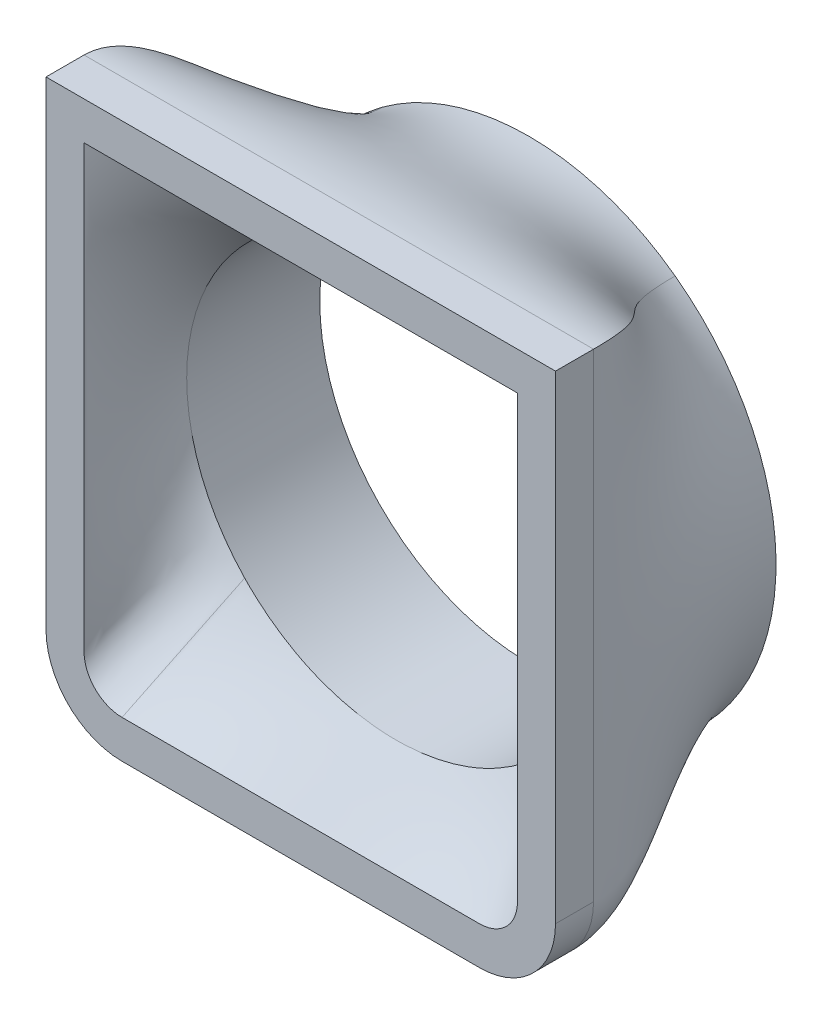
ISO-10303-21;
HEADER;
FILE_DESCRIPTION(('STEP AP214'),'2;1');
FILE_NAME('part.step','',(''),(''),'','','');
FILE_SCHEMA(('AUTOMOTIVE_DESIGN { 1 0 10303 214 1 1 1 1 }'));
ENDSEC;
DATA;
#1=APPLICATION_CONTEXT('core data for automotive mechanical design processes');
#2=APPLICATION_PROTOCOL_DEFINITION('international standard','automotive_design',2000,#1);
#3=PRODUCT_CONTEXT('',#1,'mechanical');
#4=PRODUCT('Part','Part','',(#3));
#5=PRODUCT_RELATED_PRODUCT_CATEGORY('part','',(#4));
#6=PRODUCT_DEFINITION_FORMATION('','',#4);
#7=PRODUCT_DEFINITION_CONTEXT('part definition',#1,'design');
#8=PRODUCT_DEFINITION('design','',#6,#7);
#9=PRODUCT_DEFINITION_SHAPE('','',#8);
#10=(LENGTH_UNIT() NAMED_UNIT(*) SI_UNIT(.MILLI.,.METRE.));
#11=(NAMED_UNIT(*) PLANE_ANGLE_UNIT() SI_UNIT($,.RADIAN.));
#12=(NAMED_UNIT(*) SI_UNIT($,.STERADIAN.) SOLID_ANGLE_UNIT());
#13=UNCERTAINTY_MEASURE_WITH_UNIT(LENGTH_MEASURE(1.E-05),#10,'distance_accuracy_value','');
#14=(GEOMETRIC_REPRESENTATION_CONTEXT(3) GLOBAL_UNCERTAINTY_ASSIGNED_CONTEXT((#13)) GLOBAL_UNIT_ASSIGNED_CONTEXT((#10,
#11,#12)) REPRESENTATION_CONTEXT('',''));
#15=CARTESIAN_POINT('',(0.,0.,0.));
#16=DIRECTION('',(0.,0.,1.));
#17=DIRECTION('',(1.,0.,0.));
#18=AXIS2_PLACEMENT_3D('',#15,#16,#17);
#19=CARTESIAN_POINT('',(0.,0.,0.));
#20=DIRECTION('',(0.,0.,1.));
#21=DIRECTION('',(1.,0.,0.));
#22=AXIS2_PLACEMENT_3D('',#19,#20,#21);
#23=PLANE('',#22);
#24=CARTESIAN_POINT('',(0.,0.,0.));
#25=DIRECTION('',(0.,0.,-1.));
#26=DIRECTION('',(-1.,0.,0.));
#27=AXIS2_PLACEMENT_3D('',#24,#25,#26);
#28=CIRCLE('',#27,11.);
#29=CARTESIAN_POINT('',(-11.,0.,0.));
#30=VERTEX_POINT('',#29);
#31=EDGE_CURVE('E384',#30,#30,#28,.T.);
#32=ORIENTED_EDGE('',*,*,#31,.F.);
#33=EDGE_LOOP('',(#32));
#34=FACE_BOUND('',#33,.T.);
#35=CARTESIAN_POINT('',(0.,0.,0.));
#36=DIRECTION('',(0.,0.,1.));
#37=DIRECTION('',(1.,0.,0.));
#38=AXIS2_PLACEMENT_3D('',#35,#36,#37);
#39=CIRCLE('',#38,13.);
#40=CARTESIAN_POINT('',(-7.69265166550448,10.4796522057371,0.));
#41=VERTEX_POINT('',#40);
#42=CARTESIAN_POINT('',(7.69265166550448,10.4796522057371,0.));
#43=VERTEX_POINT('',#42);
#44=EDGE_CURVE('E12',#41,#43,#39,.T.);
#45=ORIENTED_EDGE('',*,*,#44,.F.);
#46=EDGE_CURVE('E279',#43,#41,#39,.T.);
#47=ORIENTED_EDGE('',*,*,#46,.F.);
#48=EDGE_LOOP('',(#45,#47));
#49=FACE_BOUND('',#48,.T.);
#50=ADVANCED_FACE('F269',(#34,#49),#23,.F.);
#51=CARTESIAN_POINT('',(-13.4,15.,10.));
#52=CARTESIAN_POINT('',(-13.4,15.,5.8767950815959));
#53=CARTESIAN_POINT('',(-7.69265166550448,10.4796522057371,4.1232049184041));
#54=CARTESIAN_POINT('',(-7.69265166550448,10.4796522057371,0.));
#55=CARTESIAN_POINT('',(-4.46666666666667,15.,10.));
#56=CARTESIAN_POINT('',(-4.46666666666667,15.,5.8767950815959));
#57=CARTESIAN_POINT('',(-3.11602208232269,13.8391546485936,4.1232049184041));
#58=CARTESIAN_POINT('',(-3.11602208232269,13.8391546485936,0.));
#59=CARTESIAN_POINT('',(4.46666666666667,15.,10.));
#60=CARTESIAN_POINT('',(4.46666666666667,15.,5.8767950815959));
#61=CARTESIAN_POINT('',(3.11602208232269,13.8391546485936,4.1232049184041));
#62=CARTESIAN_POINT('',(3.11602208232269,13.8391546485936,0.));
#63=CARTESIAN_POINT('',(13.4,15.,10.));
#64=CARTESIAN_POINT('',(13.4,15.,5.8767950815959));
#65=CARTESIAN_POINT('',(7.69265166550448,10.4796522057371,4.1232049184041));
#66=CARTESIAN_POINT('',(7.69265166550448,10.4796522057371,0.));
#67=B_SPLINE_SURFACE_WITH_KNOTS('',3,3,((#51,#52,#53,#54),(#55,#56,#57,#58),(#59,#60,#61,#62),
(#63,#64,#65,#66)),.UNSPECIFIED.,.F.,.F.,.F.,(4,4),(4,4),(0.,1.),(0.,1.),.UNSPECIFIED.);
#68=DIRECTION('',(-1.,0.,0.));
#69=VECTOR('',#68,1.);
#70=CARTESIAN_POINT('',(-13.4,15.,10.));
#71=LINE('',#70,#69);
#72=CARTESIAN_POINT('',(13.4,15.,10.));
#73=VERTEX_POINT('',#72);
#74=CARTESIAN_POINT('',(-13.4,15.,10.));
#75=VERTEX_POINT('',#74);
#76=EDGE_CURVE('E632',#73,#75,#71,.T.);
#77=CARTESIAN_POINT('',(13.4,15.,10.));
#78=CARTESIAN_POINT('',(13.4,15.,5.8767950815959));
#79=CARTESIAN_POINT('',(7.69265166550448,10.4796522057371,4.1232049184041));
#80=CARTESIAN_POINT('',(7.69265166550448,10.4796522057371,0.));
#81=B_SPLINE_CURVE_WITH_KNOTS('',3,(#77,#78,#79,#80),.UNSPECIFIED.,.F.,.F.,(4,4),(0.,1.),.UNSPECIFIED.);
#82=EDGE_CURVE('E609',#73,#43,#81,.T.);
#83=CARTESIAN_POINT('',(-13.4,15.,10.));
#84=CARTESIAN_POINT('',(-13.4,15.,5.8767950815959));
#85=CARTESIAN_POINT('',(-7.69265166550448,10.4796522057371,4.1232049184041));
#86=CARTESIAN_POINT('',(-7.69265166550448,10.4796522057371,0.));
#87=B_SPLINE_CURVE_WITH_KNOTS('',3,(#83,#84,#85,#86),.UNSPECIFIED.,.F.,.F.,(4,4),(0.,1.),.UNSPECIFIED.);
#88=EDGE_CURVE('E607',#41,#75,#87,.F.);
#89=ORIENTED_EDGE('',*,*,#76,.F.);
#90=ORIENTED_EDGE('',*,*,#82,.T.);
#91=ORIENTED_EDGE('',*,*,#46,.T.);
#92=ORIENTED_EDGE('',*,*,#88,.T.);
#93=EDGE_LOOP('',(#89,#90,#91,#92));
#94=FACE_BOUND('',#93,.T.);
#95=ADVANCED_FACE('F586',(#94),#67,.T.);
#96=CARTESIAN_POINT('',(13.4,15.,10.));
#97=CARTESIAN_POINT('',(13.4,15.,5.8767950815959));
#98=CARTESIAN_POINT('',(7.69265166550448,10.4796522057371,4.1232049184041));
#99=CARTESIAN_POINT('',(7.69265166550448,10.4796522057371,0.));
#100=CARTESIAN_POINT('',(13.4,12.9020833333333,10.));
#101=CARTESIAN_POINT('',(13.4,12.9020833333333,6.1337226809788));
#102=CARTESIAN_POINT('',(8.92775609041624,9.57301638187191,3.86627731902121));
#103=CARTESIAN_POINT('',(8.92775609041624,9.57301638187191,0.));
#104=CARTESIAN_POINT('',(13.4,8.69735008420666,10.));
#105=CARTESIAN_POINT('',(13.4,8.69735008420666,6.64757787974457));
#106=CARTESIAN_POINT('',(11.0689278091288,7.32356056857871,3.35242212025542));
#107=CARTESIAN_POINT('',(11.0689278091288,7.32356056857871,0.));
#108=CARTESIAN_POINT('',(13.4,2.38354515193374,10.));
#109=CARTESIAN_POINT('',(13.4,2.38354515193374,6.66545895489865));
#110=CARTESIAN_POINT('',(12.9165240236095,3.0526310536303,3.33454104510135));
#111=CARTESIAN_POINT('',(12.9165240236095,3.0526310536303,0.));
#112=CARTESIAN_POINT('',(13.4,-3.91673356817753,10.));
#113=CARTESIAN_POINT('',(13.4,-3.91673356817753,6.59854738851388));
#114=CARTESIAN_POINT('',(13.1774998267635,-1.60365416654489,3.40145261148611));
#115=CARTESIAN_POINT('',(13.1774998267635,-1.60365416654489,0.));
#116=CARTESIAN_POINT('',(13.4,-8.09469657652134,10.));
#117=CARTESIAN_POINT('',(13.4,-8.09469657652134,6.45138828769898));
#118=CARTESIAN_POINT('',(12.2597390702441,-4.59206604195995,3.54861171230103));
#119=CARTESIAN_POINT('',(12.2597390702441,-4.59206604195995,0.));
#120=CARTESIAN_POINT('',(13.4,-10.7162120152648,10.));
#121=CARTESIAN_POINT('',(13.4,-10.7162120152648,6.29989288413059));
#122=CARTESIAN_POINT('',(11.3661306888584,-6.32239822564816,3.70010711586941));
#123=CARTESIAN_POINT('',(11.3661306888584,-6.32239822564816,0.));
#124=CARTESIAN_POINT('',(13.1757099352675,-11.8064991604023,10.));
#125=CARTESIAN_POINT('',(13.1757099352675,-11.8064991604023,6.23102696787553));
#126=CARTESIAN_POINT('',(10.964816176041,-7.01844815544798,3.76897303212447));
#127=CARTESIAN_POINT('',(10.964816176041,-7.01844815544798,0.));
#128=CARTESIAN_POINT('',(12.2245815934309,-13.1577001753222,9.99999999999999));
#129=CARTESIAN_POINT('',(12.2245815934309,-13.1577001753222,6.19649163253392));
#130=CARTESIAN_POINT('',(10.2618115860262,-8.01243132426781,3.80350836746608));
#131=CARTESIAN_POINT('',(10.2618115860262,-8.01243132426781,0.));
#132=CARTESIAN_POINT('',(10.8709658276346,-14.0003842708687,10.));
#133=CARTESIAN_POINT('',(10.8709658276346,-14.0003842708687,6.23637901421204));
#134=CARTESIAN_POINT('',(9.44816218605449,-8.95929124671979,3.76362098578797));
#135=CARTESIAN_POINT('',(9.44816218605449,-8.95929124671979,0.));
#136=CARTESIAN_POINT('',(9.87949135155925,-14.175,10.));
#137=CARTESIAN_POINT('',(9.87949135155925,-14.175,6.31860704975307));
#138=CARTESIAN_POINT('',(8.82087858381757,-9.55998234468915,3.68139295024693));
#139=CARTESIAN_POINT('',(8.82087858381757,-9.55998234468915,0.));
#140=CARTESIAN_POINT('',(7.78922591241414,-14.175,10.));
#141=CARTESIAN_POINT('',(7.78922591241414,-14.175,6.48033204126006));
#142=CARTESIAN_POINT('',(7.33904403981695,-10.8355235842249,3.51966795873993));
#143=CARTESIAN_POINT('',(7.33904403981695,-10.8355235842249,0.));
#144=CARTESIAN_POINT('',(4.63651689899366,-14.175,10.));
#145=CARTESIAN_POINT('',(4.63651689899366,-14.175,6.63895373009054));
#146=CARTESIAN_POINT('',(4.6705138273629,-12.4315334186043,3.36104626990948));
#147=CARTESIAN_POINT('',(4.6705138273629,-12.4315334186043,0.));
#148=CARTESIAN_POINT('',(0.,-14.175,10.));
#149=CARTESIAN_POINT('',(0.,-14.175,6.64615681112916));
#150=CARTESIAN_POINT('',(0.,-13.2850299836054,3.35384318887083));
#151=CARTESIAN_POINT('',(0.,-13.2850299836054,0.));
#152=CARTESIAN_POINT('',(-4.63651689899366,-14.175,10.));
#153=CARTESIAN_POINT('',(-4.63651689899366,-14.175,6.63895373009054));
#154=CARTESIAN_POINT('',(-4.6705138273629,-12.4315334186043,3.36104626990947));
#155=CARTESIAN_POINT('',(-4.6705138273629,-12.4315334186043,0.));
#156=CARTESIAN_POINT('',(-7.78922591241415,-14.175,10.));
#157=CARTESIAN_POINT('',(-7.78922591241415,-14.175,6.48033204126006));
#158=CARTESIAN_POINT('',(-7.33904403981695,-10.8355235842249,3.51966795873994));
#159=CARTESIAN_POINT('',(-7.33904403981695,-10.8355235842249,0.));
#160=CARTESIAN_POINT('',(-9.87949135155925,-14.175,10.));
#161=CARTESIAN_POINT('',(-9.87949135155925,-14.175,6.31860704975307));
#162=CARTESIAN_POINT('',(-8.82087858381757,-9.55998234468915,3.68139295024692));
#163=CARTESIAN_POINT('',(-8.82087858381757,-9.55998234468915,0.));
#164=CARTESIAN_POINT('',(-10.8709658276345,-14.0003842708687,9.99999999999998));
#165=CARTESIAN_POINT('',(-10.8709658276345,-14.0003842708687,6.23637901421202));
#166=CARTESIAN_POINT('',(-9.44816218605449,-8.95929124671979,3.76362098578796));
#167=CARTESIAN_POINT('',(-9.44816218605449,-8.95929124671979,0.));
#168=CARTESIAN_POINT('',(-12.2245815934309,-13.1577001753223,10.));
#169=CARTESIAN_POINT('',(-12.2245815934309,-13.1577001753223,6.19649163253391));
#170=CARTESIAN_POINT('',(-10.2618115860262,-8.01243132426781,3.80350836746609));
#171=CARTESIAN_POINT('',(-10.2618115860262,-8.01243132426781,0.));
#172=CARTESIAN_POINT('',(-13.1757099352675,-11.8064991604022,10.));
#173=CARTESIAN_POINT('',(-13.1757099352675,-11.8064991604022,6.23102696787553));
#174=CARTESIAN_POINT('',(-10.964816176041,-7.01844815544797,3.76897303212446));
#175=CARTESIAN_POINT('',(-10.964816176041,-7.01844815544797,0.));
#176=CARTESIAN_POINT('',(-13.4,-10.7162120152648,10.));
#177=CARTESIAN_POINT('',(-13.4,-10.7162120152648,6.29989288413059));
#178=CARTESIAN_POINT('',(-11.3661306888584,-6.32239822564816,3.70010711586941));
#179=CARTESIAN_POINT('',(-11.3661306888584,-6.32239822564816,0.));
#180=CARTESIAN_POINT('',(-13.4,-8.09469657652134,10.));
#181=CARTESIAN_POINT('',(-13.4,-8.09469657652134,6.45138828769897));
#182=CARTESIAN_POINT('',(-12.2597390702441,-4.59206604195994,3.54861171230103));
#183=CARTESIAN_POINT('',(-12.2597390702441,-4.59206604195994,0.));
#184=CARTESIAN_POINT('',(-13.4,-3.91673356817753,10.));
#185=CARTESIAN_POINT('',(-13.4,-3.91673356817753,6.59854738851389));
#186=CARTESIAN_POINT('',(-13.1774998267634,-1.60365416654489,3.40145261148612));
#187=CARTESIAN_POINT('',(-13.1774998267634,-1.60365416654489,0.));
#188=CARTESIAN_POINT('',(-13.4,2.38354515193375,9.99999999999998));
#189=CARTESIAN_POINT('',(-13.4,2.38354515193375,6.66545895489863));
#190=CARTESIAN_POINT('',(-12.9165240236095,3.05263105363031,3.33454104510133));
#191=CARTESIAN_POINT('',(-12.9165240236095,3.05263105363031,0.));
#192=CARTESIAN_POINT('',(-13.4,8.69735008420666,10.));
#193=CARTESIAN_POINT('',(-13.4,8.69735008420666,6.64757787974459));
#194=CARTESIAN_POINT('',(-11.0689278091288,7.32356056857869,3.35242212025542));
#195=CARTESIAN_POINT('',(-11.0689278091288,7.32356056857869,0.));
#196=CARTESIAN_POINT('',(-13.4,12.9020833333333,10.));
#197=CARTESIAN_POINT('',(-13.4,12.9020833333333,6.1337226809788));
#198=CARTESIAN_POINT('',(-8.92775609041625,9.57301638187191,3.86627731902121));
#199=CARTESIAN_POINT('',(-8.92775609041625,9.57301638187191,0.));
#200=CARTESIAN_POINT('',(-13.4,15.,10.));
#201=CARTESIAN_POINT('',(-13.4,15.,5.8767950815959));
#202=CARTESIAN_POINT('',(-7.69265166550448,10.4796522057371,4.1232049184041));
#203=CARTESIAN_POINT('',(-7.69265166550448,10.4796522057371,0.));
#204=B_SPLINE_SURFACE_WITH_KNOTS('',3,3,((#96,#97,#98,#99),(#100,#101,#102,#103),(#104,#105,
#106,#107),(#108,#109,#110,#111),(#112,#113,#114,#115),(#116,#117,#118,#119),(#120,#121,#122,
#123),(#124,#125,#126,#127),(#128,#129,#130,#131),(#132,#133,#134,#135),(#136,#137,#138,#139),
(#140,#141,#142,#143),(#144,#145,#146,#147),(#148,#149,#150,#151),(#152,#153,#154,#155),(#156,
#157,#158,#159),(#160,#161,#162,#163),(#164,#165,#166,#167),(#168,#169,#170,#171),(#172,#173,
#174,#175),(#176,#177,#178,#179),(#180,#181,#182,#183),(#184,#185,#186,#187),(#188,#189,#190,
#191),(#192,#193,#194,#195),(#196,#197,#198,#199),(#200,#201,#202,#203)),.UNSPECIFIED.,.F.,.F.,
.F.,(4,1,1,1,2,1,1,1,2,1,1,1,2,1,1,1,2,1,1,1,4),(4,4),(0.,0.0736531837923083,0.147306367584617,
0.220959551376925,0.294612735169233,0.313774357382793,0.332935979596354,0.352097601809914,
0.371259224023474,0.435629612011737,0.5,0.564370387988263,0.628740775976526,0.647902398190086,
0.667064020403646,0.686225642617207,0.705387264830767,0.779040448623075,0.852693632415383,
0.926346816207692,1.),(0.,1.),.UNSPECIFIED.);
#205=DIRECTION('',(0.,1.,0.));
#206=VECTOR('',#205,1.);
#207=CARTESIAN_POINT('',(13.4,15.,10.));
#208=LINE('',#207,#206);
#209=CARTESIAN_POINT('',(13.4,-10.175,10.));
#210=VERTEX_POINT('',#209);
#211=EDGE_CURVE('E694',#210,#73,#208,.T.);
#212=CARTESIAN_POINT('',(9.4,-10.175,10.));
#213=DIRECTION('',(0.,0.,1.));
#214=DIRECTION('',(1.,0.,0.));
#215=AXIS2_PLACEMENT_3D('',#212,#213,#214);
#216=CIRCLE('',#215,4.);
#217=CARTESIAN_POINT('',(9.4,-14.175,10.));
#218=VERTEX_POINT('',#217);
#219=EDGE_CURVE('E742',#218,#210,#216,.T.);
#220=DIRECTION('',(1.,0.,0.));
#221=VECTOR('',#220,1.);
#222=CARTESIAN_POINT('',(-9.4,-14.175,10.));
#223=LINE('',#222,#221);
#224=CARTESIAN_POINT('',(-9.4,-14.175,10.));
#225=VERTEX_POINT('',#224);
#226=EDGE_CURVE('E746',#225,#218,#223,.T.);
#227=CARTESIAN_POINT('',(-9.4,-10.175,10.));
#228=DIRECTION('',(0.,0.,1.));
#229=DIRECTION('',(1.,0.,0.));
#230=AXIS2_PLACEMENT_3D('',#227,#228,#229);
#231=CIRCLE('',#230,4.);
#232=CARTESIAN_POINT('',(-13.4,-10.175,10.));
#233=VERTEX_POINT('',#232);
#234=EDGE_CURVE('E618',#233,#225,#231,.T.);
#235=DIRECTION('',(0.,-1.,0.));
#236=VECTOR('',#235,1.);
#237=CARTESIAN_POINT('',(-13.4,15.,10.));
#238=LINE('',#237,#236);
#239=EDGE_CURVE('E613',#75,#233,#238,.T.);
#240=ORIENTED_EDGE('',*,*,#211,.F.);
#241=ORIENTED_EDGE('',*,*,#219,.F.);
#242=ORIENTED_EDGE('',*,*,#226,.F.);
#243=ORIENTED_EDGE('',*,*,#234,.F.);
#244=ORIENTED_EDGE('',*,*,#239,.F.);
#245=ORIENTED_EDGE('',*,*,#88,.F.);
#246=ORIENTED_EDGE('',*,*,#44,.T.);
#247=ORIENTED_EDGE('',*,*,#82,.F.);
#248=EDGE_LOOP('',(#240,#241,#242,#243,#244,#245,#246,#247));
#249=FACE_BOUND('',#248,.T.);
#250=ADVANCED_FACE('F591',(#249),#204,.T.);
#251=CARTESIAN_POINT('',(-9.4,-10.175,12.));
#252=DIRECTION('',(0.,0.,-1.));
#253=DIRECTION('',(-1.,0.,0.));
#254=AXIS2_PLACEMENT_3D('',#251,#252,#253);
#255=CYLINDRICAL_SURFACE('',#254,4.);
#256=ORIENTED_EDGE('',*,*,#234,.T.);
#257=DIRECTION('',(0.,0.,-1.));
#258=VECTOR('',#257,1.);
#259=CARTESIAN_POINT('',(-9.4,-14.175,12.));
#260=LINE('',#259,#258);
#261=CARTESIAN_POINT('',(-9.4,-14.175,12.));
#262=VERTEX_POINT('',#261);
#263=EDGE_CURVE('E732',#262,#225,#260,.T.);
#264=ORIENTED_EDGE('',*,*,#263,.F.);
#265=CARTESIAN_POINT('',(-9.4,-10.175,12.));
#266=DIRECTION('',(0.,0.,1.));
#267=DIRECTION('',(1.,0.,0.));
#268=AXIS2_PLACEMENT_3D('',#265,#266,#267);
#269=CIRCLE('',#268,4.);
#270=CARTESIAN_POINT('',(-13.4,-10.175,12.));
#271=VERTEX_POINT('',#270);
#272=EDGE_CURVE('E383',#271,#262,#269,.T.);
#273=ORIENTED_EDGE('',*,*,#272,.F.);
#274=DIRECTION('',(0.,0.,-1.));
#275=VECTOR('',#274,1.);
#276=CARTESIAN_POINT('',(-13.4,-10.175,12.));
#277=LINE('',#276,#275);
#278=EDGE_CURVE('E776',#271,#233,#277,.T.);
#279=ORIENTED_EDGE('',*,*,#278,.T.);
#280=EDGE_LOOP('',(#256,#264,#273,#279));
#281=FACE_BOUND('',#280,.T.);
#282=ADVANCED_FACE('F646',(#281),#255,.T.);
#283=CARTESIAN_POINT('',(-9.4,-14.175,12.));
#284=DIRECTION('',(0.,1.,0.));
#285=DIRECTION('',(0.,0.,1.));
#286=AXIS2_PLACEMENT_3D('',#283,#284,#285);
#287=PLANE('',#286);
#288=ORIENTED_EDGE('',*,*,#226,.T.);
#289=DIRECTION('',(0.,0.,-1.));
#290=VECTOR('',#289,1.);
#291=CARTESIAN_POINT('',(9.4,-14.175,12.));
#292=LINE('',#291,#290);
#293=CARTESIAN_POINT('',(9.4,-14.175,12.));
#294=VERTEX_POINT('',#293);
#295=EDGE_CURVE('E724',#294,#218,#292,.T.);
#296=ORIENTED_EDGE('',*,*,#295,.F.);
#297=DIRECTION('',(1.,0.,0.));
#298=VECTOR('',#297,1.);
#299=CARTESIAN_POINT('',(-9.4,-14.175,12.));
#300=LINE('',#299,#298);
#301=EDGE_CURVE('E815',#262,#294,#300,.T.);
#302=ORIENTED_EDGE('',*,*,#301,.F.);
#303=ORIENTED_EDGE('',*,*,#263,.T.);
#304=EDGE_LOOP('',(#288,#296,#302,#303));
#305=FACE_BOUND('',#304,.T.);
#306=ADVANCED_FACE('F714',(#305),#287,.F.);
#307=CARTESIAN_POINT('',(9.4,-10.175,12.));
#308=DIRECTION('',(0.,0.,-1.));
#309=DIRECTION('',(-1.,0.,0.));
#310=AXIS2_PLACEMENT_3D('',#307,#308,#309);
#311=CYLINDRICAL_SURFACE('',#310,4.);
#312=ORIENTED_EDGE('',*,*,#219,.T.);
#313=DIRECTION('',(0.,0.,-1.));
#314=VECTOR('',#313,1.);
#315=CARTESIAN_POINT('',(13.4,-10.175,12.));
#316=LINE('',#315,#314);
#317=CARTESIAN_POINT('',(13.4,-10.175,12.));
#318=VERTEX_POINT('',#317);
#319=EDGE_CURVE('E686',#318,#210,#316,.T.);
#320=ORIENTED_EDGE('',*,*,#319,.F.);
#321=CARTESIAN_POINT('',(9.4,-10.175,12.));
#322=DIRECTION('',(0.,0.,1.));
#323=DIRECTION('',(1.,0.,0.));
#324=AXIS2_PLACEMENT_3D('',#321,#322,#323);
#325=CIRCLE('',#324,4.);
#326=EDGE_CURVE('E741',#294,#318,#325,.T.);
#327=ORIENTED_EDGE('',*,*,#326,.F.);
#328=ORIENTED_EDGE('',*,*,#295,.T.);
#329=EDGE_LOOP('',(#312,#320,#327,#328));
#330=FACE_BOUND('',#329,.T.);
#331=ADVANCED_FACE('F710',(#330),#311,.T.);
#332=CARTESIAN_POINT('',(13.4,-10.175,12.));
#333=DIRECTION('',(-1.,0.,0.));
#334=DIRECTION('',(0.,-1.,0.));
#335=AXIS2_PLACEMENT_3D('',#332,#333,#334);
#336=PLANE('',#335);
#337=ORIENTED_EDGE('',*,*,#211,.T.);
#338=DIRECTION('',(0.,0.,-1.));
#339=VECTOR('',#338,1.);
#340=CARTESIAN_POINT('',(13.4,15.,12.));
#341=LINE('',#340,#339);
#342=CARTESIAN_POINT('',(13.4,15.,12.));
#343=VERTEX_POINT('',#342);
#344=EDGE_CURVE('E678',#343,#73,#341,.T.);
#345=ORIENTED_EDGE('',*,*,#344,.F.);
#346=DIRECTION('',(0.,1.,0.));
#347=VECTOR('',#346,1.);
#348=CARTESIAN_POINT('',(13.4,-10.175,12.));
#349=LINE('',#348,#347);
#350=EDGE_CURVE('E739',#318,#343,#349,.T.);
#351=ORIENTED_EDGE('',*,*,#350,.F.);
#352=ORIENTED_EDGE('',*,*,#319,.T.);
#353=EDGE_LOOP('',(#337,#345,#351,#352));
#354=FACE_BOUND('',#353,.T.);
#355=ADVANCED_FACE('F700',(#354),#336,.F.);
#356=CARTESIAN_POINT('',(13.4,15.,12.));
#357=DIRECTION('',(0.,-1.,0.));
#358=DIRECTION('',(0.,0.,-1.));
#359=AXIS2_PLACEMENT_3D('',#356,#357,#358);
#360=PLANE('',#359);
#361=ORIENTED_EDGE('',*,*,#76,.T.);
#362=DIRECTION('',(0.,0.,-1.));
#363=VECTOR('',#362,1.);
#364=CARTESIAN_POINT('',(-13.4,15.,12.));
#365=LINE('',#364,#363);
#366=CARTESIAN_POINT('',(-13.4,15.,12.));
#367=VERTEX_POINT('',#366);
#368=EDGE_CURVE('E687',#367,#75,#365,.T.);
#369=ORIENTED_EDGE('',*,*,#368,.F.);
#370=DIRECTION('',(-1.,0.,0.));
#371=VECTOR('',#370,1.);
#372=CARTESIAN_POINT('',(13.4,15.,12.));
#373=LINE('',#372,#371);
#374=EDGE_CURVE('E811',#343,#367,#373,.T.);
#375=ORIENTED_EDGE('',*,*,#374,.F.);
#376=ORIENTED_EDGE('',*,*,#344,.T.);
#377=EDGE_LOOP('',(#361,#369,#375,#376));
#378=FACE_BOUND('',#377,.T.);
#379=ADVANCED_FACE('F709',(#378),#360,.F.);
#380=CARTESIAN_POINT('',(-13.4,15.,12.));
#381=DIRECTION('',(1.,0.,0.));
#382=DIRECTION('',(0.,1.,0.));
#383=AXIS2_PLACEMENT_3D('',#380,#381,#382);
#384=PLANE('',#383);
#385=ORIENTED_EDGE('',*,*,#239,.T.);
#386=ORIENTED_EDGE('',*,*,#278,.F.);
#387=DIRECTION('',(0.,-1.,0.));
#388=VECTOR('',#387,1.);
#389=CARTESIAN_POINT('',(-13.4,15.,12.));
#390=LINE('',#389,#388);
#391=EDGE_CURVE('E799',#367,#271,#390,.T.);
#392=ORIENTED_EDGE('',*,*,#391,.F.);
#393=ORIENTED_EDGE('',*,*,#368,.T.);
#394=EDGE_LOOP('',(#385,#386,#392,#393));
#395=FACE_BOUND('',#394,.T.);
#396=ADVANCED_FACE('F414',(#395),#384,.F.);
#397=CARTESIAN_POINT('',(-9.4,-10.175,12.));
#398=DIRECTION('',(0.,0.,1.));
#399=DIRECTION('',(1.,0.,0.));
#400=AXIS2_PLACEMENT_3D('',#397,#398,#399);
#401=PLANE('',#400);
#402=DIRECTION('',(1.,0.,0.));
#403=VECTOR('',#402,1.);
#404=CARTESIAN_POINT('',(-9.4,-12.175,12.));
#405=LINE('',#404,#403);
#406=CARTESIAN_POINT('',(-9.4,-12.175,12.));
#407=VERTEX_POINT('',#406);
#408=CARTESIAN_POINT('',(9.4,-12.175,12.));
#409=VERTEX_POINT('',#408);
#410=EDGE_CURVE('E458',#407,#409,#405,.T.);
#411=ORIENTED_EDGE('',*,*,#410,.F.);
#412=CARTESIAN_POINT('',(-9.4,-10.175,12.));
#413=DIRECTION('',(0.,0.,1.));
#414=DIRECTION('',(1.,0.,0.));
#415=AXIS2_PLACEMENT_3D('',#412,#413,#414);
#416=CIRCLE('',#415,2.);
#417=CARTESIAN_POINT('',(-11.4,-10.174999999899,12.));
#418=VERTEX_POINT('',#417);
#419=EDGE_CURVE('E460',#418,#407,#416,.T.);
#420=ORIENTED_EDGE('',*,*,#419,.F.);
#421=DIRECTION('',(0.,-1.,0.));
#422=VECTOR('',#421,1.);
#423=CARTESIAN_POINT('',(-11.4,13.,12.));
#424=LINE('',#423,#422);
#425=CARTESIAN_POINT('',(-11.4,13.,12.));
#426=VERTEX_POINT('',#425);
#427=EDGE_CURVE('E293',#426,#418,#424,.T.);
#428=ORIENTED_EDGE('',*,*,#427,.F.);
#429=DIRECTION('',(-1.,0.,0.));
#430=VECTOR('',#429,1.);
#431=CARTESIAN_POINT('',(11.4,13.,12.));
#432=LINE('',#431,#430);
#433=CARTESIAN_POINT('',(11.4,13.,12.));
#434=VERTEX_POINT('',#433);
#435=EDGE_CURVE('E365',#434,#426,#432,.T.);
#436=ORIENTED_EDGE('',*,*,#435,.F.);
#437=DIRECTION('',(0.,1.,0.));
#438=VECTOR('',#437,1.);
#439=CARTESIAN_POINT('',(11.4,-10.175,12.));
#440=LINE('',#439,#438);
#441=CARTESIAN_POINT('',(11.4,-10.1749999999987,12.));
#442=VERTEX_POINT('',#441);
#443=EDGE_CURVE('E487',#442,#434,#440,.T.);
#444=ORIENTED_EDGE('',*,*,#443,.F.);
#445=CARTESIAN_POINT('',(9.4,-10.175,12.));
#446=DIRECTION('',(0.,0.,1.));
#447=DIRECTION('',(1.,0.,0.));
#448=AXIS2_PLACEMENT_3D('',#445,#446,#447);
#449=CIRCLE('',#448,2.);
#450=EDGE_CURVE('E367',#409,#442,#449,.T.);
#451=ORIENTED_EDGE('',*,*,#450,.F.);
#452=EDGE_LOOP('',(#411,#420,#428,#436,#444,#451));
#453=FACE_BOUND('',#452,.T.);
#454=ORIENTED_EDGE('',*,*,#272,.T.);
#455=ORIENTED_EDGE('',*,*,#301,.T.);
#456=ORIENTED_EDGE('',*,*,#326,.T.);
#457=ORIENTED_EDGE('',*,*,#350,.T.);
#458=ORIENTED_EDGE('',*,*,#374,.T.);
#459=ORIENTED_EDGE('',*,*,#391,.T.);
#460=EDGE_LOOP('',(#454,#455,#456,#457,#458,#459));
#461=FACE_BOUND('',#460,.T.);
#462=ADVANCED_FACE('F406',(#453,#461),#401,.T.);
#463=CARTESIAN_POINT('',(0.,0.,7.));
#464=DIRECTION('',(0.,0.,-1.));
#465=DIRECTION('',(-1.,0.,0.));
#466=AXIS2_PLACEMENT_3D('',#463,#464,#465);
#467=CYLINDRICAL_SURFACE('',#466,11.);
#468=CARTESIAN_POINT('',(0.,0.,7.));
#469=DIRECTION('',(0.,0.,-1.));
#470=DIRECTION('',(-1.,0.,0.));
#471=AXIS2_PLACEMENT_3D('',#468,#469,#470);
#472=CIRCLE('',#471,11.);
#473=CARTESIAN_POINT('',(-6.33474695333965,8.99406153336744,7.));
#474=VERTEX_POINT('',#473);
#475=CARTESIAN_POINT('',(6.3347416803912,8.99405371791429,7.));
#476=VERTEX_POINT('',#475);
#477=EDGE_CURVE('E361',#474,#476,#472,.T.);
#478=ORIENTED_EDGE('',*,*,#477,.F.);
#479=CARTESIAN_POINT('',(0.,0.,7.));
#480=DIRECTION('',(0.,0.,-1.));
#481=DIRECTION('',(-1.,0.,0.));
#482=AXIS2_PLACEMENT_3D('',#479,#480,#481);
#483=CIRCLE('',#482,11.);
#484=CARTESIAN_POINT('',(-7.94994681914989,-7.60260006092962,7.));
#485=VERTEX_POINT('',#484);
#486=EDGE_CURVE('E371',#485,#474,#483,.T.);
#487=ORIENTED_EDGE('',*,*,#486,.F.);
#488=EDGE_CURVE('E273',#476,#485,#483,.T.);
#489=ORIENTED_EDGE('',*,*,#488,.F.);
#490=EDGE_LOOP('',(#478,#487,#489));
#491=FACE_BOUND('',#490,.T.);
#492=ORIENTED_EDGE('',*,*,#31,.T.);
#493=EDGE_LOOP('',(#492));
#494=FACE_BOUND('',#493,.T.);
#495=ADVANCED_FACE('F380',(#491,#494),#467,.F.);
#496=CARTESIAN_POINT('',(-7.94990807088616,-7.60256283528516,7.));
#497=CARTESIAN_POINT('',(-9.4,-12.175,12.));
#498=CARTESIAN_POINT('',(-6.99138448250131,-8.60487936676696,7.));
#499=CARTESIAN_POINT('',(-7.70521778378737,-12.175,12.));
#500=CARTESIAN_POINT('',(-4.62143665334408,-10.3114570120628,7.));
#501=CARTESIAN_POINT('',(-4.47701171988998,-12.175,12.));
#502=CARTESIAN_POINT('',(-0.139334024388409,-11.3196874849372,7.));
#503=CARTESIAN_POINT('',(0.144444582558416,-12.175,12.));
#504=CARTESIAN_POINT('',(4.44077104318473,-10.411634855814,7.));
#505=CARTESIAN_POINT('',(4.70685560340955,-12.175,12.));
#506=CARTESIAN_POINT('',(6.94016393995395,-8.65844006904784,7.));
#507=CARTESIAN_POINT('',(7.80626123294158,-12.175,12.));
#508=CARTESIAN_POINT('',(8.09862410094434,-7.44705228006258,7.));
#509=CARTESIAN_POINT('',(9.63472728588012,-12.175,12.));
#510=CARTESIAN_POINT('',(8.37253439220808,-7.14266694548944,7.));
#511=CARTESIAN_POINT('',(10.1256295931423,-12.091346255038,12.));
#512=CARTESIAN_POINT('',(8.73807639306365,-6.68994377139384,7.00000000000001));
#513=CARTESIAN_POINT('',(10.809610208638,-11.6707952586236,12.));
#514=CARTESIAN_POINT('',(9.07126832101951,-6.23043399554512,7.));
#515=CARTESIAN_POINT('',(11.2906320933266,-10.9866564031158,12.));
#516=CARTESIAN_POINT('',(9.27758484888465,-5.91296760795086,7.));
#517=CARTESIAN_POINT('',(11.4,-10.4416699400277,12.));
#518=CARTESIAN_POINT('',(10.101795349597,-4.56862657997048,7.));
#519=CARTESIAN_POINT('',(11.4,-8.24862055396365,12.));
#520=CARTESIAN_POINT('',(11.0768062042386,-1.97531423211147,6.99999999999999));
#521=CARTESIAN_POINT('',(11.4,-4.32159378941536,12.));
#522=CARTESIAN_POINT('',(11.0470238169768,2.1404306517727,7.00000000000001));
#523=CARTESIAN_POINT('',(11.4,1.63363238050818,12.));
#524=CARTESIAN_POINT('',(9.51932518432498,6.02522305424801,6.99999999999999));
#525=CARTESIAN_POINT('',(11.4,7.47538132332373,12.));
#526=CARTESIAN_POINT('',(7.54051523871965,8.14357631231546,7.));
#527=CARTESIAN_POINT('',(11.4,11.196865549546,12.));
#528=CARTESIAN_POINT('',(6.334165812349,8.99323876374186,7.));
#529=CARTESIAN_POINT('',(11.4,13.,12.));
#530=B_SPLINE_SURFACE_WITH_KNOTS('',3,1,((#496,#497),(#498,#499),(#500,#501),(#502,#503),(#504,
#505),(#506,#507),(#508,#509),(#510,#511),(#512,#513),(#514,#515),(#516,#517),(#518,#519),(#520,
#521),(#522,#523),(#524,#525),(#526,#527),(#528,#529)),.UNSPECIFIED.,.F.,.F.,.F.,(4,1,1,1,2,1,1,
1,2,1,1,1,4),(2,2),(0.,0.113060078884402,0.226120157768804,0.339180236653206,0.452240315537608,
0.46889190623687,0.485543496936132,0.502195087635393,0.518846678334655,0.639135008750991,
0.759423339167328,0.879711669583664,1.),(0.,1.),.UNSPECIFIED.);
#531=DIRECTION('',(0.209281055282759,0.65990607618264,-0.721613061492769));
#532=VECTOR('',#531,1.);
#533=CARTESIAN_POINT('',(-8.67495403544308,-9.88878141764258,9.5));
#534=LINE('',#533,#532);
#535=EDGE_CURVE('E287',#407,#485,#534,.T.);
#536=DIRECTION('',(0.620202237811857,0.490541575790775,0.61214226012739));
#537=VECTOR('',#536,1.);
#538=CARTESIAN_POINT('',(8.8670829061745,10.9966193818709,9.5));
#539=LINE('',#538,#537);
#540=EDGE_CURVE('E368',#476,#434,#539,.T.);
#541=ORIENTED_EDGE('',*,*,#488,.T.);
#542=ORIENTED_EDGE('',*,*,#535,.F.);
#543=ORIENTED_EDGE('',*,*,#410,.T.);
#544=ORIENTED_EDGE('',*,*,#450,.T.);
#545=ORIENTED_EDGE('',*,*,#443,.T.);
#546=ORIENTED_EDGE('',*,*,#540,.F.);
#547=EDGE_LOOP('',(#541,#542,#543,#544,#545,#546));
#548=FACE_BOUND('',#547,.T.);
#549=ADVANCED_FACE('F405',(#548),#530,.F.);
#550=CARTESIAN_POINT('',(6.334165812349,8.99323876374186,7.));
#551=CARTESIAN_POINT('',(11.4,13.,12.));
#552=CARTESIAN_POINT('',(5.38467203560295,9.66199127634618,7.));
#553=CARTESIAN_POINT('',(9.5,13.,12.));
#554=CARTESIAN_POINT('',(3.32638369414267,10.6651200452527,7.00000000000002));
#555=CARTESIAN_POINT('',(5.7,13.,12.));
#556=CARTESIAN_POINT('',(0.,11.1666844297059,6.99999999999998));
#557=CARTESIAN_POINT('',(0.,13.,12.));
#558=CARTESIAN_POINT('',(-3.32638369414267,10.6651200452527,7.00000000000001));
#559=CARTESIAN_POINT('',(-5.7,13.,12.));
#560=CARTESIAN_POINT('',(-5.38467203560294,9.66199127634618,7.));
#561=CARTESIAN_POINT('',(-9.5,13.,12.));
#562=CARTESIAN_POINT('',(-6.334165812349,8.99323876374186,7.));
#563=CARTESIAN_POINT('',(-11.4,13.,12.));
#564=B_SPLINE_SURFACE_WITH_KNOTS('',3,1,((#550,#551),(#552,#553),(#554,#555),(#556,#557),(#558,
#559),(#560,#561),(#562,#563)),.UNSPECIFIED.,.F.,.F.,.F.,(4,1,1,1,4),(2,2),(0.,0.25,0.5,0.75,
1.),(0.,1.),.UNSPECIFIED.);
#565=DIRECTION('',(-0.620202237811857,0.490541575790775,0.61214226012739));
#566=VECTOR('',#565,1.);
#567=CARTESIAN_POINT('',(-8.8670829061745,10.9966193818709,9.5));
#568=LINE('',#567,#566);
#569=EDGE_CURVE('E358',#474,#426,#568,.T.);
#570=ORIENTED_EDGE('',*,*,#477,.T.);
#571=ORIENTED_EDGE('',*,*,#540,.T.);
#572=ORIENTED_EDGE('',*,*,#435,.T.);
#573=ORIENTED_EDGE('',*,*,#569,.F.);
#574=EDGE_LOOP('',(#570,#571,#572,#573));
#575=FACE_BOUND('',#574,.T.);
#576=ADVANCED_FACE('F359',(#575),#564,.F.);
#577=CARTESIAN_POINT('',(-6.334165812349,8.99323876374186,7.));
#578=CARTESIAN_POINT('',(-11.4,13.,12.));
#579=CARTESIAN_POINT('',(-7.46661235082264,8.19562798782956,7.));
#580=CARTESIAN_POINT('',(-11.4,11.0736205539636,12.));
#581=CARTESIAN_POINT('',(-9.42211255509451,6.171632951972,7.00000000000001));
#582=CARTESIAN_POINT('',(-11.4,7.21358316943213,12.));
#583=CARTESIAN_POINT('',(-11.0301533044651,2.27717743385705,6.99999999999998));
#584=CARTESIAN_POINT('',(-11.4,1.4125,12.));
#585=CARTESIAN_POINT('',(-11.0958712527022,-1.93569094593973,7.00000000000002));
#586=CARTESIAN_POINT('',(-11.4,-4.38858316943214,12.));
#587=CARTESIAN_POINT('',(-10.101795349597,-4.56862657997049,7.));
#588=CARTESIAN_POINT('',(-11.4,-8.24862055396365,12.));
#589=CARTESIAN_POINT('',(-9.27758484888465,-5.91296760795086,7.));
#590=CARTESIAN_POINT('',(-11.4,-10.4416699400277,12.));
#591=CARTESIAN_POINT('',(-9.06583619643718,-6.2390880428752,7.));
#592=CARTESIAN_POINT('',(-11.2926447795379,-10.9669684955959,12.));
#593=CARTESIAN_POINT('',(-8.71748249064638,-6.71734938677123,7.00000000000001));
#594=CARTESIAN_POINT('',(-10.850199827592,-11.625199827592,12.));
#595=CARTESIAN_POINT('',(-8.34381285746725,-7.17609866222921,7.));
#596=CARTESIAN_POINT('',(-10.1919684955959,-12.0676447795379,12.));
#597=CARTESIAN_POINT('',(-8.08243185779614,-7.46398431302023,7.));
#598=CARTESIAN_POINT('',(-9.66666994002768,-12.175,12.));
#599=CARTESIAN_POINT('',(-7.94990807088616,-7.60256283528516,7.));
#600=CARTESIAN_POINT('',(-9.4,-12.175,12.));
#601=B_SPLINE_SURFACE_WITH_KNOTS('',3,1,((#577,#578),(#579,#580),(#581,#582),(#583,#584),(#585,
#586),(#587,#588),(#589,#590),(#591,#592),(#593,#594),(#595,#596),(#597,#598),(#599,#600)),
.UNSPECIFIED.,.F.,.F.,.F.,(4,1,1,1,2,1,1,1,4),(2,2),(0.,0.219600554455546,0.439201108911092,
0.658801663366638,0.878402217822184,0.908801663366638,0.939201108911092,0.969600554455546,1.),
(0.,1.),.UNSPECIFIED.);
#602=ORIENTED_EDGE('',*,*,#486,.T.);
#603=ORIENTED_EDGE('',*,*,#569,.T.);
#604=ORIENTED_EDGE('',*,*,#427,.T.);
#605=ORIENTED_EDGE('',*,*,#419,.T.);
#606=ORIENTED_EDGE('',*,*,#535,.T.);
#607=EDGE_LOOP('',(#602,#603,#604,#605,#606));
#608=FACE_BOUND('',#607,.T.);
#609=ADVANCED_FACE('F373',(#608),#601,.F.);
#610=CLOSED_SHELL('',(#50,#95,#250,#282,#306,#331,#355,#379,#396,#462,#495,#549,#576,#609));
#611=MANIFOLD_SOLID_BREP('B2',#610);
#612=ADVANCED_BREP_SHAPE_REPRESENTATION('',(#18,#611),#14);
#613=SHAPE_DEFINITION_REPRESENTATION(#9,#612);
ENDSEC;
END-ISO-10303-21;
